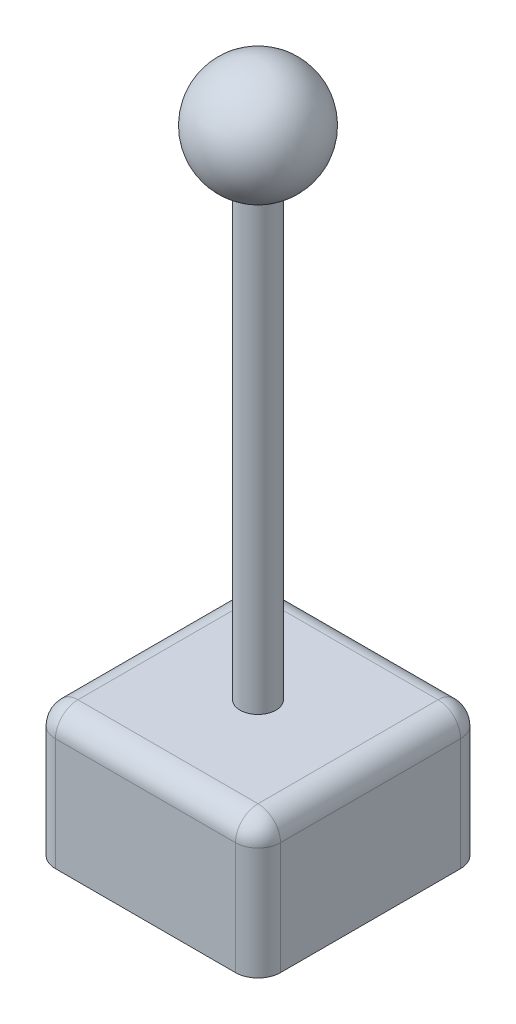
ISO-10303-21;
HEADER;
FILE_DESCRIPTION(('STEP AP214'),'2;1');
FILE_NAME('part.step','',(''),(''),'','','');
FILE_SCHEMA(('AUTOMOTIVE_DESIGN { 1 0 10303 214 1 1 1 1 }'));
ENDSEC;
DATA;
#1=APPLICATION_CONTEXT('core data for automotive mechanical design processes');
#2=APPLICATION_PROTOCOL_DEFINITION('international standard','automotive_design',2000,#1);
#3=PRODUCT_CONTEXT('',#1,'mechanical');
#4=PRODUCT('Part','Part','',(#3));
#5=PRODUCT_RELATED_PRODUCT_CATEGORY('part','',(#4));
#6=PRODUCT_DEFINITION_FORMATION('','',#4);
#7=PRODUCT_DEFINITION_CONTEXT('part definition',#1,'design');
#8=PRODUCT_DEFINITION('design','',#6,#7);
#9=PRODUCT_DEFINITION_SHAPE('','',#8);
#10=(LENGTH_UNIT() NAMED_UNIT(*) SI_UNIT(.MILLI.,.METRE.));
#11=(NAMED_UNIT(*) PLANE_ANGLE_UNIT() SI_UNIT($,.RADIAN.));
#12=(NAMED_UNIT(*) SI_UNIT($,.STERADIAN.) SOLID_ANGLE_UNIT());
#13=UNCERTAINTY_MEASURE_WITH_UNIT(LENGTH_MEASURE(1.E-05),#10,'distance_accuracy_value','');
#14=(GEOMETRIC_REPRESENTATION_CONTEXT(3) GLOBAL_UNCERTAINTY_ASSIGNED_CONTEXT((#13)) GLOBAL_UNIT_ASSIGNED_CONTEXT((#10,
#11,#12)) REPRESENTATION_CONTEXT('',''));
#15=CARTESIAN_POINT('',(0.,0.,0.));
#16=DIRECTION('',(0.,0.,1.));
#17=DIRECTION('',(1.,0.,0.));
#18=AXIS2_PLACEMENT_3D('',#15,#16,#17);
#19=CARTESIAN_POINT('',(-25.,30.,-25.));
#20=DIRECTION('',(1.,0.,0.));
#21=DIRECTION('',(0.,0.,-1.));
#22=AXIS2_PLACEMENT_3D('',#19,#20,#21);
#23=PLANE('',#22);
#24=DIRECTION('',(0.,0.,1.));
#25=VECTOR('',#24,1.);
#26=CARTESIAN_POINT('',(-25.,25.,-25.));
#27=LINE('',#26,#25);
#28=CARTESIAN_POINT('',(-25.,25.,20.));
#29=VERTEX_POINT('',#28);
#30=CARTESIAN_POINT('',(-25.,25.,-20.));
#31=VERTEX_POINT('',#30);
#32=EDGE_CURVE('E163',#29,#31,#27,.F.);
#33=ORIENTED_EDGE('',*,*,#32,.T.);
#34=DIRECTION('',(0.,-1.,0.));
#35=VECTOR('',#34,1.);
#36=CARTESIAN_POINT('',(-25.,30.,-20.));
#37=LINE('',#36,#35);
#38=CARTESIAN_POINT('',(-25.,0.,-20.));
#39=VERTEX_POINT('',#38);
#40=EDGE_CURVE('E167',#31,#39,#37,.T.);
#41=ORIENTED_EDGE('',*,*,#40,.T.);
#42=DIRECTION('',(0.,0.,1.));
#43=VECTOR('',#42,1.);
#44=CARTESIAN_POINT('',(-25.,0.,-25.));
#45=LINE('',#44,#43);
#46=CARTESIAN_POINT('',(-25.,0.,20.));
#47=VERTEX_POINT('',#46);
#48=EDGE_CURVE('E204',#39,#47,#45,.T.);
#49=ORIENTED_EDGE('',*,*,#48,.T.);
#50=DIRECTION('',(0.,-1.,0.));
#51=VECTOR('',#50,1.);
#52=CARTESIAN_POINT('',(-25.,30.,20.));
#53=LINE('',#52,#51);
#54=EDGE_CURVE('E165',#47,#29,#53,.F.);
#55=ORIENTED_EDGE('',*,*,#54,.T.);
#56=EDGE_LOOP('',(#33,#41,#49,#55));
#57=FACE_BOUND('',#56,.T.);
#58=ADVANCED_FACE('F35',(#57),#23,.F.);
#59=CARTESIAN_POINT('',(-25.,30.,25.));
#60=DIRECTION('',(0.,0.,-1.));
#61=DIRECTION('',(-1.,0.,0.));
#62=AXIS2_PLACEMENT_3D('',#59,#60,#61);
#63=PLANE('',#62);
#64=DIRECTION('',(1.,0.,0.));
#65=VECTOR('',#64,1.);
#66=CARTESIAN_POINT('',(-25.,0.,25.));
#67=LINE('',#66,#65);
#68=CARTESIAN_POINT('',(-20.,0.,25.));
#69=VERTEX_POINT('',#68);
#70=CARTESIAN_POINT('',(20.,0.,25.));
#71=VERTEX_POINT('',#70);
#72=EDGE_CURVE('E141',#69,#71,#67,.T.);
#73=ORIENTED_EDGE('',*,*,#72,.T.);
#74=DIRECTION('',(0.,-1.,0.));
#75=VECTOR('',#74,1.);
#76=CARTESIAN_POINT('',(20.,30.,25.));
#77=LINE('',#76,#75);
#78=CARTESIAN_POINT('',(20.,25.,25.));
#79=VERTEX_POINT('',#78);
#80=EDGE_CURVE('E11',#71,#79,#77,.F.);
#81=ORIENTED_EDGE('',*,*,#80,.T.);
#82=DIRECTION('',(1.,0.,0.));
#83=VECTOR('',#82,1.);
#84=CARTESIAN_POINT('',(-25.,25.,25.));
#85=LINE('',#84,#83);
#86=CARTESIAN_POINT('',(-20.,25.,25.));
#87=VERTEX_POINT('',#86);
#88=EDGE_CURVE('E51',#79,#87,#85,.F.);
#89=ORIENTED_EDGE('',*,*,#88,.T.);
#90=DIRECTION('',(0.,-1.,0.));
#91=VECTOR('',#90,1.);
#92=CARTESIAN_POINT('',(-20.,30.,25.));
#93=LINE('',#92,#91);
#94=EDGE_CURVE('E44',#87,#69,#93,.T.);
#95=ORIENTED_EDGE('',*,*,#94,.T.);
#96=EDGE_LOOP('',(#73,#81,#89,#95));
#97=FACE_BOUND('',#96,.T.);
#98=ADVANCED_FACE('F230',(#97),#63,.F.);
#99=CARTESIAN_POINT('',(25.,30.,-25.));
#100=DIRECTION('',(-1.,0.,0.));
#101=DIRECTION('',(0.,0.,1.));
#102=AXIS2_PLACEMENT_3D('',#99,#100,#101);
#103=PLANE('',#102);
#104=DIRECTION('',(0.,0.,-1.));
#105=VECTOR('',#104,1.);
#106=CARTESIAN_POINT('',(25.,0.,-25.));
#107=LINE('',#106,#105);
#108=CARTESIAN_POINT('',(25.,0.,20.));
#109=VERTEX_POINT('',#108);
#110=CARTESIAN_POINT('',(25.,0.,-20.));
#111=VERTEX_POINT('',#110);
#112=EDGE_CURVE('E138',#109,#111,#107,.T.);
#113=ORIENTED_EDGE('',*,*,#112,.T.);
#114=DIRECTION('',(0.,-1.,0.));
#115=VECTOR('',#114,1.);
#116=CARTESIAN_POINT('',(25.,30.,-20.));
#117=LINE('',#116,#115);
#118=CARTESIAN_POINT('',(25.,25.,-20.));
#119=VERTEX_POINT('',#118);
#120=EDGE_CURVE('E116',#111,#119,#117,.F.);
#121=ORIENTED_EDGE('',*,*,#120,.T.);
#122=DIRECTION('',(0.,0.,-1.));
#123=VECTOR('',#122,1.);
#124=CARTESIAN_POINT('',(25.,25.,25.));
#125=LINE('',#124,#123);
#126=CARTESIAN_POINT('',(25.,25.,20.));
#127=VERTEX_POINT('',#126);
#128=EDGE_CURVE('E151',#119,#127,#125,.F.);
#129=ORIENTED_EDGE('',*,*,#128,.T.);
#130=DIRECTION('',(0.,-1.,0.));
#131=VECTOR('',#130,1.);
#132=CARTESIAN_POINT('',(25.,30.,20.));
#133=LINE('',#132,#131);
#134=EDGE_CURVE('E121',#127,#109,#133,.T.);
#135=ORIENTED_EDGE('',*,*,#134,.T.);
#136=EDGE_LOOP('',(#113,#121,#129,#135));
#137=FACE_BOUND('',#136,.T.);
#138=ADVANCED_FACE('F235',(#137),#103,.F.);
#139=CARTESIAN_POINT('',(-25.,30.,-25.));
#140=DIRECTION('',(0.,0.,1.));
#141=DIRECTION('',(1.,0.,0.));
#142=AXIS2_PLACEMENT_3D('',#139,#140,#141);
#143=PLANE('',#142);
#144=DIRECTION('',(-1.,0.,0.));
#145=VECTOR('',#144,1.);
#146=CARTESIAN_POINT('',(25.,25.,-25.));
#147=LINE('',#146,#145);
#148=CARTESIAN_POINT('',(-20.,25.,-25.));
#149=VERTEX_POINT('',#148);
#150=CARTESIAN_POINT('',(20.,25.,-25.));
#151=VERTEX_POINT('',#150);
#152=EDGE_CURVE('E130',#149,#151,#147,.F.);
#153=ORIENTED_EDGE('',*,*,#152,.T.);
#154=DIRECTION('',(0.,-1.,0.));
#155=VECTOR('',#154,1.);
#156=CARTESIAN_POINT('',(20.,30.,-25.));
#157=LINE('',#156,#155);
#158=CARTESIAN_POINT('',(20.,0.,-25.));
#159=VERTEX_POINT('',#158);
#160=EDGE_CURVE('E115',#151,#159,#157,.T.);
#161=ORIENTED_EDGE('',*,*,#160,.T.);
#162=DIRECTION('',(-1.,0.,0.));
#163=VECTOR('',#162,1.);
#164=CARTESIAN_POINT('',(-25.,0.,-25.));
#165=LINE('',#164,#163);
#166=CARTESIAN_POINT('',(-20.,0.,-25.));
#167=VERTEX_POINT('',#166);
#168=EDGE_CURVE('E127',#159,#167,#165,.T.);
#169=ORIENTED_EDGE('',*,*,#168,.T.);
#170=DIRECTION('',(0.,-1.,0.));
#171=VECTOR('',#170,1.);
#172=CARTESIAN_POINT('',(-20.,30.,-25.));
#173=LINE('',#172,#171);
#174=EDGE_CURVE('E137',#167,#149,#173,.F.);
#175=ORIENTED_EDGE('',*,*,#174,.T.);
#176=EDGE_LOOP('',(#153,#161,#169,#175));
#177=FACE_BOUND('',#176,.T.);
#178=ADVANCED_FACE('F126',(#177),#143,.F.);
#179=CARTESIAN_POINT('',(0.,30.,0.));
#180=DIRECTION('',(0.,1.,0.));
#181=DIRECTION('',(0.,0.,1.));
#182=AXIS2_PLACEMENT_3D('',#179,#180,#181);
#183=PLANE('',#182);
#184=CARTESIAN_POINT('',(0.,30.,0.));
#185=DIRECTION('',(0.,1.,0.));
#186=DIRECTION('',(0.,0.,1.));
#187=AXIS2_PLACEMENT_3D('',#184,#185,#186);
#188=CIRCLE('',#187,4.);
#189=CARTESIAN_POINT('',(0.,30.,4.));
#190=VERTEX_POINT('',#189);
#191=EDGE_CURVE('E174',#190,#190,#188,.T.);
#192=ORIENTED_EDGE('',*,*,#191,.F.);
#193=EDGE_LOOP('',(#192));
#194=FACE_BOUND('',#193,.T.);
#195=DIRECTION('',(0.,0.,-1.));
#196=VECTOR('',#195,1.);
#197=CARTESIAN_POINT('',(20.,30.,-25.));
#198=LINE('',#197,#196);
#199=CARTESIAN_POINT('',(20.,30.,20.));
#200=VERTEX_POINT('',#199);
#201=CARTESIAN_POINT('',(20.,30.,-20.));
#202=VERTEX_POINT('',#201);
#203=EDGE_CURVE('E158',#200,#202,#198,.T.);
#204=ORIENTED_EDGE('',*,*,#203,.T.);
#205=DIRECTION('',(-1.,0.,0.));
#206=VECTOR('',#205,1.);
#207=CARTESIAN_POINT('',(-25.,30.,-20.));
#208=LINE('',#207,#206);
#209=CARTESIAN_POINT('',(-20.,30.,-20.));
#210=VERTEX_POINT('',#209);
#211=EDGE_CURVE('E160',#202,#210,#208,.T.);
#212=ORIENTED_EDGE('',*,*,#211,.T.);
#213=DIRECTION('',(0.,0.,1.));
#214=VECTOR('',#213,1.);
#215=CARTESIAN_POINT('',(-20.,30.,25.));
#216=LINE('',#215,#214);
#217=CARTESIAN_POINT('',(-20.,30.,20.));
#218=VERTEX_POINT('',#217);
#219=EDGE_CURVE('E156',#210,#218,#216,.T.);
#220=ORIENTED_EDGE('',*,*,#219,.T.);
#221=DIRECTION('',(1.,0.,0.));
#222=VECTOR('',#221,1.);
#223=CARTESIAN_POINT('',(25.,30.,20.));
#224=LINE('',#223,#222);
#225=EDGE_CURVE('E154',#218,#200,#224,.T.);
#226=ORIENTED_EDGE('',*,*,#225,.T.);
#227=EDGE_LOOP('',(#204,#212,#220,#226));
#228=FACE_BOUND('',#227,.T.);
#229=ADVANCED_FACE('F301',(#194,#228),#183,.T.);
#230=CARTESIAN_POINT('',(0.,0.,0.));
#231=DIRECTION('',(0.,1.,0.));
#232=DIRECTION('',(0.,0.,1.));
#233=AXIS2_PLACEMENT_3D('',#230,#231,#232);
#234=PLANE('',#233);
#235=ORIENTED_EDGE('',*,*,#168,.F.);
#236=CARTESIAN_POINT('',(20.,0.,-20.));
#237=DIRECTION('',(0.,1.,0.));
#238=DIRECTION('',(0.,0.,1.));
#239=AXIS2_PLACEMENT_3D('',#236,#237,#238);
#240=CIRCLE('',#239,5.);
#241=EDGE_CURVE('E111',#159,#111,#240,.F.);
#242=ORIENTED_EDGE('',*,*,#241,.T.);
#243=ORIENTED_EDGE('',*,*,#112,.F.);
#244=CARTESIAN_POINT('',(20.,0.,20.));
#245=DIRECTION('',(0.,1.,0.));
#246=DIRECTION('',(0.,0.,1.));
#247=AXIS2_PLACEMENT_3D('',#244,#245,#246);
#248=CIRCLE('',#247,5.);
#249=EDGE_CURVE('E147',#109,#71,#248,.F.);
#250=ORIENTED_EDGE('',*,*,#249,.T.);
#251=ORIENTED_EDGE('',*,*,#72,.F.);
#252=CARTESIAN_POINT('',(-20.,0.,20.));
#253=DIRECTION('',(0.,1.,0.));
#254=DIRECTION('',(0.,0.,1.));
#255=AXIS2_PLACEMENT_3D('',#252,#253,#254);
#256=CIRCLE('',#255,5.);
#257=EDGE_CURVE('E132',#69,#47,#256,.F.);
#258=ORIENTED_EDGE('',*,*,#257,.T.);
#259=ORIENTED_EDGE('',*,*,#48,.F.);
#260=CARTESIAN_POINT('',(-20.,0.,-20.));
#261=DIRECTION('',(0.,1.,0.));
#262=DIRECTION('',(0.,0.,1.));
#263=AXIS2_PLACEMENT_3D('',#260,#261,#262);
#264=CIRCLE('',#263,5.);
#265=EDGE_CURVE('E122',#39,#167,#264,.F.);
#266=ORIENTED_EDGE('',*,*,#265,.T.);
#267=EDGE_LOOP('',(#235,#242,#243,#250,#251,#258,#259,#266));
#268=FACE_BOUND('',#267,.T.);
#269=ADVANCED_FACE('F134',(#268),#234,.F.);
#270=CARTESIAN_POINT('',(-20.,30.,20.));
#271=DIRECTION('',(0.,-1.,0.));
#272=DIRECTION('',(0.,0.,-1.));
#273=AXIS2_PLACEMENT_3D('',#270,#271,#272);
#274=CYLINDRICAL_SURFACE('',#273,5.);
#275=CARTESIAN_POINT('',(-20.,25.,20.));
#276=DIRECTION('',(0.,1.,0.));
#277=DIRECTION('',(0.,0.,1.));
#278=AXIS2_PLACEMENT_3D('',#275,#276,#277);
#279=CIRCLE('',#278,5.);
#280=EDGE_CURVE('E202',#29,#87,#279,.T.);
#281=ORIENTED_EDGE('',*,*,#280,.F.);
#282=ORIENTED_EDGE('',*,*,#54,.F.);
#283=ORIENTED_EDGE('',*,*,#257,.F.);
#284=ORIENTED_EDGE('',*,*,#94,.F.);
#285=EDGE_LOOP('',(#281,#282,#283,#284));
#286=FACE_BOUND('',#285,.T.);
#287=ADVANCED_FACE('F37',(#286),#274,.T.);
#288=CARTESIAN_POINT('',(-20.,25.,20.));
#289=DIRECTION('',(0.,0.,1.));
#290=DIRECTION('',(1.,0.,0.));
#291=AXIS2_PLACEMENT_3D('',#288,#289,#290);
#292=SPHERICAL_SURFACE('',#291,5.);
#293=CARTESIAN_POINT('',(-20.,25.,20.));
#294=DIRECTION('',(0.,0.,1.));
#295=DIRECTION('',(1.,0.,0.));
#296=AXIS2_PLACEMENT_3D('',#293,#294,#295);
#297=CIRCLE('',#296,5.);
#298=EDGE_CURVE('E197',#29,#218,#297,.F.);
#299=ORIENTED_EDGE('',*,*,#298,.F.);
#300=ORIENTED_EDGE('',*,*,#280,.T.);
#301=CARTESIAN_POINT('',(-20.,25.,20.));
#302=DIRECTION('',(-1.,0.,0.));
#303=DIRECTION('',(0.,0.,1.));
#304=AXIS2_PLACEMENT_3D('',#301,#302,#303);
#305=CIRCLE('',#304,5.);
#306=EDGE_CURVE('E200',#218,#87,#305,.F.);
#307=ORIENTED_EDGE('',*,*,#306,.F.);
#308=EDGE_LOOP('',(#299,#300,#307));
#309=FACE_BOUND('',#308,.T.);
#310=ADVANCED_FACE('F275',(#309),#292,.T.);
#311=CARTESIAN_POINT('',(20.,30.,20.));
#312=DIRECTION('',(0.,-1.,0.));
#313=DIRECTION('',(0.,0.,-1.));
#314=AXIS2_PLACEMENT_3D('',#311,#312,#313);
#315=CYLINDRICAL_SURFACE('',#314,5.);
#316=ORIENTED_EDGE('',*,*,#249,.F.);
#317=ORIENTED_EDGE('',*,*,#134,.F.);
#318=CARTESIAN_POINT('',(20.,25.,20.));
#319=DIRECTION('',(0.,1.,0.));
#320=DIRECTION('',(0.,0.,1.));
#321=AXIS2_PLACEMENT_3D('',#318,#319,#320);
#322=CIRCLE('',#321,5.);
#323=EDGE_CURVE('E194',#79,#127,#322,.T.);
#324=ORIENTED_EDGE('',*,*,#323,.F.);
#325=ORIENTED_EDGE('',*,*,#80,.F.);
#326=EDGE_LOOP('',(#316,#317,#324,#325));
#327=FACE_BOUND('',#326,.T.);
#328=ADVANCED_FACE('F272',(#327),#315,.T.);
#329=CARTESIAN_POINT('',(0.,25.,20.));
#330=DIRECTION('',(-1.,0.,0.));
#331=DIRECTION('',(0.,0.,1.));
#332=AXIS2_PLACEMENT_3D('',#329,#330,#331);
#333=CYLINDRICAL_SURFACE('',#332,5.);
#334=ORIENTED_EDGE('',*,*,#306,.T.);
#335=ORIENTED_EDGE('',*,*,#88,.F.);
#336=CARTESIAN_POINT('',(20.,25.,20.));
#337=DIRECTION('',(1.,0.,0.));
#338=DIRECTION('',(0.,0.,-1.));
#339=AXIS2_PLACEMENT_3D('',#336,#337,#338);
#340=CIRCLE('',#339,5.);
#341=EDGE_CURVE('E191',#200,#79,#340,.T.);
#342=ORIENTED_EDGE('',*,*,#341,.F.);
#343=ORIENTED_EDGE('',*,*,#225,.F.);
#344=EDGE_LOOP('',(#334,#335,#342,#343));
#345=FACE_BOUND('',#344,.T.);
#346=ADVANCED_FACE('F268',(#345),#333,.T.);
#347=CARTESIAN_POINT('',(-20.,25.,0.));
#348=DIRECTION('',(0.,0.,-1.));
#349=DIRECTION('',(-1.,0.,0.));
#350=AXIS2_PLACEMENT_3D('',#347,#348,#349);
#351=CYLINDRICAL_SURFACE('',#350,5.);
#352=ORIENTED_EDGE('',*,*,#298,.T.);
#353=ORIENTED_EDGE('',*,*,#219,.F.);
#354=CARTESIAN_POINT('',(-20.,25.,-20.));
#355=DIRECTION('',(0.,0.,-1.));
#356=DIRECTION('',(-1.,0.,0.));
#357=AXIS2_PLACEMENT_3D('',#354,#355,#356);
#358=CIRCLE('',#357,5.);
#359=EDGE_CURVE('E188',#31,#210,#358,.T.);
#360=ORIENTED_EDGE('',*,*,#359,.F.);
#361=ORIENTED_EDGE('',*,*,#32,.F.);
#362=EDGE_LOOP('',(#352,#353,#360,#361));
#363=FACE_BOUND('',#362,.T.);
#364=ADVANCED_FACE('F264',(#363),#351,.T.);
#365=CARTESIAN_POINT('',(-20.,30.,-20.));
#366=DIRECTION('',(0.,-1.,0.));
#367=DIRECTION('',(0.,0.,-1.));
#368=AXIS2_PLACEMENT_3D('',#365,#366,#367);
#369=CYLINDRICAL_SURFACE('',#368,5.);
#370=ORIENTED_EDGE('',*,*,#265,.F.);
#371=ORIENTED_EDGE('',*,*,#40,.F.);
#372=CARTESIAN_POINT('',(-20.,25.,-20.));
#373=DIRECTION('',(0.,1.,0.));
#374=DIRECTION('',(0.,0.,1.));
#375=AXIS2_PLACEMENT_3D('',#372,#373,#374);
#376=CIRCLE('',#375,5.);
#377=EDGE_CURVE('E185',#149,#31,#376,.T.);
#378=ORIENTED_EDGE('',*,*,#377,.F.);
#379=ORIENTED_EDGE('',*,*,#174,.F.);
#380=EDGE_LOOP('',(#370,#371,#378,#379));
#381=FACE_BOUND('',#380,.T.);
#382=ADVANCED_FACE('F260',(#381),#369,.T.);
#383=CARTESIAN_POINT('',(20.,25.,20.));
#384=DIRECTION('',(0.,0.,1.));
#385=DIRECTION('',(1.,0.,0.));
#386=AXIS2_PLACEMENT_3D('',#383,#384,#385);
#387=SPHERICAL_SURFACE('',#386,5.);
#388=ORIENTED_EDGE('',*,*,#341,.T.);
#389=ORIENTED_EDGE('',*,*,#323,.T.);
#390=CARTESIAN_POINT('',(20.,25.,20.));
#391=DIRECTION('',(0.,0.,1.));
#392=DIRECTION('',(0.,-1.,0.));
#393=AXIS2_PLACEMENT_3D('',#390,#391,#392);
#394=CIRCLE('',#393,5.);
#395=EDGE_CURVE('E182',#200,#127,#394,.F.);
#396=ORIENTED_EDGE('',*,*,#395,.F.);
#397=EDGE_LOOP('',(#388,#389,#396));
#398=FACE_BOUND('',#397,.T.);
#399=ADVANCED_FACE('F256',(#398),#387,.T.);
#400=CARTESIAN_POINT('',(-20.,25.,-20.));
#401=DIRECTION('',(-1.,0.,0.));
#402=DIRECTION('',(0.,0.,1.));
#403=AXIS2_PLACEMENT_3D('',#400,#401,#402);
#404=SPHERICAL_SURFACE('',#403,5.);
#405=ORIENTED_EDGE('',*,*,#377,.T.);
#406=ORIENTED_EDGE('',*,*,#359,.T.);
#407=CARTESIAN_POINT('',(-20.,25.,-20.));
#408=DIRECTION('',(-1.,0.,0.));
#409=DIRECTION('',(0.,0.,1.));
#410=AXIS2_PLACEMENT_3D('',#407,#408,#409);
#411=CIRCLE('',#410,5.);
#412=EDGE_CURVE('E180',#149,#210,#411,.F.);
#413=ORIENTED_EDGE('',*,*,#412,.F.);
#414=EDGE_LOOP('',(#405,#406,#413));
#415=FACE_BOUND('',#414,.T.);
#416=ADVANCED_FACE('F252',(#415),#404,.T.);
#417=CARTESIAN_POINT('',(20.,25.,0.));
#418=DIRECTION('',(0.,0.,1.));
#419=DIRECTION('',(1.,0.,0.));
#420=AXIS2_PLACEMENT_3D('',#417,#418,#419);
#421=CYLINDRICAL_SURFACE('',#420,5.);
#422=ORIENTED_EDGE('',*,*,#395,.T.);
#423=ORIENTED_EDGE('',*,*,#128,.F.);
#424=CARTESIAN_POINT('',(20.,25.,-20.));
#425=DIRECTION('',(0.,0.,-1.));
#426=DIRECTION('',(-1.,0.,0.));
#427=AXIS2_PLACEMENT_3D('',#424,#425,#426);
#428=CIRCLE('',#427,5.);
#429=EDGE_CURVE('E177',#202,#119,#428,.T.);
#430=ORIENTED_EDGE('',*,*,#429,.F.);
#431=ORIENTED_EDGE('',*,*,#203,.F.);
#432=EDGE_LOOP('',(#422,#423,#430,#431));
#433=FACE_BOUND('',#432,.T.);
#434=ADVANCED_FACE('F248',(#433),#421,.T.);
#435=CARTESIAN_POINT('',(0.,25.,-20.));
#436=DIRECTION('',(1.,0.,0.));
#437=DIRECTION('',(0.,0.,-1.));
#438=AXIS2_PLACEMENT_3D('',#435,#436,#437);
#439=CYLINDRICAL_SURFACE('',#438,5.);
#440=ORIENTED_EDGE('',*,*,#412,.T.);
#441=ORIENTED_EDGE('',*,*,#211,.F.);
#442=CARTESIAN_POINT('',(20.,25.,-20.));
#443=DIRECTION('',(1.,0.,0.));
#444=DIRECTION('',(0.,1.,0.));
#445=AXIS2_PLACEMENT_3D('',#442,#443,#444);
#446=CIRCLE('',#445,5.);
#447=EDGE_CURVE('E173',#151,#202,#446,.T.);
#448=ORIENTED_EDGE('',*,*,#447,.F.);
#449=ORIENTED_EDGE('',*,*,#152,.F.);
#450=EDGE_LOOP('',(#440,#441,#448,#449));
#451=FACE_BOUND('',#450,.T.);
#452=ADVANCED_FACE('F244',(#451),#439,.T.);
#453=CARTESIAN_POINT('',(20.,25.,-20.));
#454=DIRECTION('',(0.,1.,0.));
#455=DIRECTION('',(0.,0.,1.));
#456=AXIS2_PLACEMENT_3D('',#453,#454,#455);
#457=SPHERICAL_SURFACE('',#456,5.);
#458=ORIENTED_EDGE('',*,*,#447,.T.);
#459=ORIENTED_EDGE('',*,*,#429,.T.);
#460=CARTESIAN_POINT('',(20.,25.,-20.));
#461=DIRECTION('',(0.,1.,0.));
#462=DIRECTION('',(0.,0.,1.));
#463=AXIS2_PLACEMENT_3D('',#460,#461,#462);
#464=CIRCLE('',#463,5.);
#465=EDGE_CURVE('E171',#151,#119,#464,.F.);
#466=ORIENTED_EDGE('',*,*,#465,.F.);
#467=EDGE_LOOP('',(#458,#459,#466));
#468=FACE_BOUND('',#467,.T.);
#469=ADVANCED_FACE('F241',(#468),#457,.T.);
#470=CARTESIAN_POINT('',(20.,30.,-20.));
#471=DIRECTION('',(0.,-1.,0.));
#472=DIRECTION('',(0.,0.,-1.));
#473=AXIS2_PLACEMENT_3D('',#470,#471,#472);
#474=CYLINDRICAL_SURFACE('',#473,5.);
#475=ORIENTED_EDGE('',*,*,#465,.T.);
#476=ORIENTED_EDGE('',*,*,#120,.F.);
#477=ORIENTED_EDGE('',*,*,#241,.F.);
#478=ORIENTED_EDGE('',*,*,#160,.F.);
#479=EDGE_LOOP('',(#475,#476,#477,#478));
#480=FACE_BOUND('',#479,.T.);
#481=ADVANCED_FACE('F114',(#480),#474,.T.);
#482=CARTESIAN_POINT('',(0.,130.,0.));
#483=DIRECTION('',(0.,-1.,0.));
#484=DIRECTION('',(0.,0.,-1.));
#485=AXIS2_PLACEMENT_3D('',#482,#483,#484);
#486=CYLINDRICAL_SURFACE('',#485,4.);
#487=CARTESIAN_POINT('',(0.,128.657280717673,0.));
#488=DIRECTION('',(0.,0.999999999999999,0.));
#489=DIRECTION('',(0.,0.,1.));
#490=AXIS2_PLACEMENT_3D('',#487,#488,#489);
#491=CIRCLE('',#490,4.);
#492=CARTESIAN_POINT('',(0.,128.657280717673,4.));
#493=VERTEX_POINT('',#492);
#494=EDGE_CURVE('E39',#493,#493,#491,.F.);
#495=ORIENTED_EDGE('',*,*,#494,.T.);
#496=EDGE_LOOP('',(#495));
#497=FACE_BOUND('',#496,.T.);
#498=ORIENTED_EDGE('',*,*,#191,.T.);
#499=EDGE_LOOP('',(#498));
#500=FACE_BOUND('',#499,.T.);
#501=ADVANCED_FACE('F220',(#497,#500),#486,.T.);
#502=CARTESIAN_POINT('',(0.,140.5,0.));
#503=DIRECTION('',(0.,-1.,0.));
#504=DIRECTION('',(1.,0.,0.));
#505=AXIS2_PLACEMENT_3D('',#502,#503,#504);
#506=SPHERICAL_SURFACE('',#505,12.5);
#507=ORIENTED_EDGE('',*,*,#494,.F.);
#508=EDGE_LOOP('',(#507));
#509=FACE_BOUND('',#508,.T.);
#510=ADVANCED_FACE('F222',(#509),#506,.T.);
#511=CLOSED_SHELL('',(#58,#98,#138,#178,#229,#269,#287,#310,#328,#346,#364,#382,#399,#416,#434,
#452,#469,#481,#501,#510));
#512=MANIFOLD_SOLID_BREP('B2',#511);
#513=ADVANCED_BREP_SHAPE_REPRESENTATION('',(#18,#512),#14);
#514=SHAPE_DEFINITION_REPRESENTATION(#9,#513);
ENDSEC;
END-ISO-10303-21;
